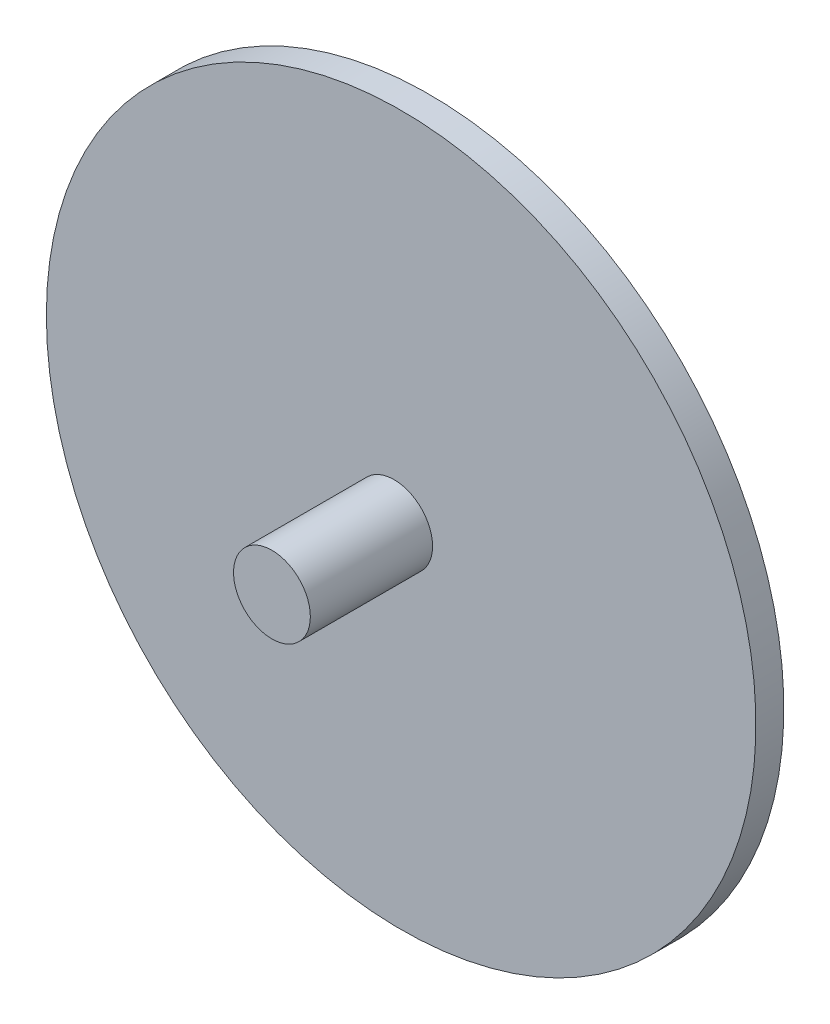
ISO-10303-21;
HEADER;
FILE_DESCRIPTION(('STEP AP214'),'2;1');
FILE_NAME('part.step','',(''),(''),'','','');
FILE_SCHEMA(('AUTOMOTIVE_DESIGN { 1 0 10303 214 1 1 1 1 }'));
ENDSEC;
DATA;
#1=APPLICATION_CONTEXT('core data for automotive mechanical design processes');
#2=APPLICATION_PROTOCOL_DEFINITION('international standard','automotive_design',2000,#1);
#3=PRODUCT_CONTEXT('',#1,'mechanical');
#4=PRODUCT('Part','Part','',(#3));
#5=PRODUCT_RELATED_PRODUCT_CATEGORY('part','',(#4));
#6=PRODUCT_DEFINITION_FORMATION('','',#4);
#7=PRODUCT_DEFINITION_CONTEXT('part definition',#1,'design');
#8=PRODUCT_DEFINITION('design','',#6,#7);
#9=PRODUCT_DEFINITION_SHAPE('','',#8);
#10=(LENGTH_UNIT() NAMED_UNIT(*) SI_UNIT(.MILLI.,.METRE.));
#11=(NAMED_UNIT(*) PLANE_ANGLE_UNIT() SI_UNIT($,.RADIAN.));
#12=(NAMED_UNIT(*) SI_UNIT($,.STERADIAN.) SOLID_ANGLE_UNIT());
#13=UNCERTAINTY_MEASURE_WITH_UNIT(LENGTH_MEASURE(1.E-05),#10,'distance_accuracy_value','');
#14=(GEOMETRIC_REPRESENTATION_CONTEXT(3) GLOBAL_UNCERTAINTY_ASSIGNED_CONTEXT((#13)) GLOBAL_UNIT_ASSIGNED_CONTEXT((#10,
#11,#12)) REPRESENTATION_CONTEXT('',''));
#15=CARTESIAN_POINT('',(0.,0.,0.));
#16=DIRECTION('',(0.,0.,1.));
#17=DIRECTION('',(1.,0.,0.));
#18=AXIS2_PLACEMENT_3D('',#15,#16,#17);
#19=CARTESIAN_POINT('',(0.,0.,-2.));
#20=DIRECTION('',(0.,0.,-1.));
#21=DIRECTION('',(-1.,0.,0.));
#22=AXIS2_PLACEMENT_3D('',#19,#20,#21);
#23=CYLINDRICAL_SURFACE('',#22,101.6);
#24=CARTESIAN_POINT('',(0.,0.,-2.));
#25=DIRECTION('',(0.,0.,-1.));
#26=DIRECTION('',(-1.,0.,0.));
#27=AXIS2_PLACEMENT_3D('',#24,#25,#26);
#28=CIRCLE('',#27,101.6);
#29=CARTESIAN_POINT('',(-101.6,0.,-2.));
#30=VERTEX_POINT('',#29);
#31=EDGE_CURVE('E11',#30,#30,#28,.T.);
#32=ORIENTED_EDGE('',*,*,#31,.T.);
#33=EDGE_LOOP('',(#32));
#34=FACE_BOUND('',#33,.T.);
#35=CARTESIAN_POINT('',(0.,0.,-10.));
#36=DIRECTION('',(0.,0.,-1.));
#37=DIRECTION('',(-1.,0.,0.));
#38=AXIS2_PLACEMENT_3D('',#35,#36,#37);
#39=CIRCLE('',#38,101.6);
#40=CARTESIAN_POINT('',(-101.6,0.,-10.));
#41=VERTEX_POINT('',#40);
#42=EDGE_CURVE('E41',#41,#41,#39,.T.);
#43=ORIENTED_EDGE('',*,*,#42,.F.);
#44=EDGE_LOOP('',(#43));
#45=FACE_BOUND('',#44,.T.);
#46=ADVANCED_FACE('F35',(#34,#45),#23,.T.);
#47=CARTESIAN_POINT('',(0.,0.,-2.));
#48=DIRECTION('',(0.,0.,-1.));
#49=DIRECTION('',(-1.,0.,0.));
#50=AXIS2_PLACEMENT_3D('',#47,#48,#49);
#51=PLANE('',#50);
#52=ORIENTED_EDGE('',*,*,#31,.F.);
#53=EDGE_LOOP('',(#52));
#54=FACE_BOUND('',#53,.T.);
#55=ADVANCED_FACE('F50',(#54),#51,.F.);
#56=CARTESIAN_POINT('',(0.,0.,-10.));
#57=DIRECTION('',(0.,0.,-1.));
#58=DIRECTION('',(-1.,0.,0.));
#59=AXIS2_PLACEMENT_3D('',#56,#57,#58);
#60=PLANE('',#59);
#61=ORIENTED_EDGE('',*,*,#42,.T.);
#62=EDGE_LOOP('',(#61));
#63=FACE_BOUND('',#62,.T.);
#64=ADVANCED_FACE('F47',(#63),#60,.T.);
#65=CLOSED_SHELL('',(#46,#55,#64));
#66=MANIFOLD_SOLID_BREP('B2',#65);
#67=CARTESIAN_POINT('',(0.,0.,0.));
#68=DIRECTION('',(0.,0.,1.));
#69=DIRECTION('',(1.,0.,0.));
#70=AXIS2_PLACEMENT_3D('',#67,#68,#69);
#71=PLANE('',#70);
#72=CARTESIAN_POINT('',(0.,0.,0.));
#73=DIRECTION('',(0.,0.,1.));
#74=DIRECTION('',(1.,0.,0.));
#75=AXIS2_PLACEMENT_3D('',#72,#73,#74);
#76=CIRCLE('',#75,11.);
#77=CARTESIAN_POINT('',(11.,0.,0.));
#78=VERTEX_POINT('',#77);
#79=EDGE_CURVE('E81',#78,#78,#76,.T.);
#80=ORIENTED_EDGE('',*,*,#79,.F.);
#81=EDGE_LOOP('',(#80));
#82=FACE_BOUND('',#81,.T.);
#83=CARTESIAN_POINT('',(0.,0.,0.));
#84=DIRECTION('',(0.,0.,1.));
#85=DIRECTION('',(1.,0.,0.));
#86=AXIS2_PLACEMENT_3D('',#83,#84,#85);
#87=CIRCLE('',#86,3.);
#88=CARTESIAN_POINT('',(3.,0.,0.));
#89=VERTEX_POINT('',#88);
#90=EDGE_CURVE('E34',#89,#89,#87,.F.);
#91=ORIENTED_EDGE('',*,*,#90,.F.);
#92=EDGE_LOOP('',(#91));
#93=FACE_BOUND('',#92,.T.);
#94=ADVANCED_FACE('F70',(#82,#93),#71,.F.);
#95=CARTESIAN_POINT('',(0.,0.,35.));
#96=DIRECTION('',(0.,0.,-1.));
#97=DIRECTION('',(-1.,0.,0.));
#98=AXIS2_PLACEMENT_3D('',#95,#96,#97);
#99=CYLINDRICAL_SURFACE('',#98,11.);
#100=CARTESIAN_POINT('',(0.,0.,35.));
#101=DIRECTION('',(0.,0.,1.));
#102=DIRECTION('',(1.,0.,0.));
#103=AXIS2_PLACEMENT_3D('',#100,#101,#102);
#104=CIRCLE('',#103,11.);
#105=CARTESIAN_POINT('',(11.,0.,35.));
#106=VERTEX_POINT('',#105);
#107=EDGE_CURVE('E77',#106,#106,#104,.T.);
#108=ORIENTED_EDGE('',*,*,#107,.F.);
#109=EDGE_LOOP('',(#108));
#110=FACE_BOUND('',#109,.T.);
#111=ORIENTED_EDGE('',*,*,#79,.T.);
#112=EDGE_LOOP('',(#111));
#113=FACE_BOUND('',#112,.T.);
#114=ADVANCED_FACE('F72',(#110,#113),#99,.T.);
#115=CARTESIAN_POINT('',(0.,0.,35.));
#116=DIRECTION('',(0.,0.,1.));
#117=DIRECTION('',(1.,0.,0.));
#118=AXIS2_PLACEMENT_3D('',#115,#116,#117);
#119=PLANE('',#118);
#120=ORIENTED_EDGE('',*,*,#107,.T.);
#121=EDGE_LOOP('',(#120));
#122=FACE_BOUND('',#121,.T.);
#123=ADVANCED_FACE('F95',(#122),#119,.T.);
#124=CARTESIAN_POINT('',(0.,0.,-10.));
#125=DIRECTION('',(0.,0.,1.));
#126=DIRECTION('',(1.,0.,0.));
#127=AXIS2_PLACEMENT_3D('',#124,#125,#126);
#128=CYLINDRICAL_SURFACE('',#127,3.);
#129=CARTESIAN_POINT('',(0.,0.,-10.));
#130=DIRECTION('',(0.,0.,-1.));
#131=DIRECTION('',(-1.,0.,0.));
#132=AXIS2_PLACEMENT_3D('',#129,#130,#131);
#133=CIRCLE('',#132,3.);
#134=CARTESIAN_POINT('',(-3.,0.,-10.));
#135=VERTEX_POINT('',#134);
#136=EDGE_CURVE('E85',#135,#135,#133,.T.);
#137=ORIENTED_EDGE('',*,*,#136,.F.);
#138=EDGE_LOOP('',(#137));
#139=FACE_BOUND('',#138,.T.);
#140=ORIENTED_EDGE('',*,*,#90,.T.);
#141=EDGE_LOOP('',(#140));
#142=FACE_BOUND('',#141,.T.);
#143=ADVANCED_FACE('F93',(#139,#142),#128,.T.);
#144=CARTESIAN_POINT('',(0.,0.,-10.));
#145=DIRECTION('',(0.,0.,-1.));
#146=DIRECTION('',(-1.,0.,0.));
#147=AXIS2_PLACEMENT_3D('',#144,#145,#146);
#148=PLANE('',#147);
#149=ORIENTED_EDGE('',*,*,#136,.T.);
#150=EDGE_LOOP('',(#149));
#151=FACE_BOUND('',#150,.T.);
#152=ADVANCED_FACE('F91',(#151),#148,.T.);
#153=CLOSED_SHELL('',(#94,#114,#123,#143,#152));
#154=MANIFOLD_SOLID_BREP('B6',#153);
#155=ADVANCED_BREP_SHAPE_REPRESENTATION('',(#18,#66,#154),#14);
#156=SHAPE_DEFINITION_REPRESENTATION(#9,#155);
ENDSEC;
END-ISO-10303-21;
